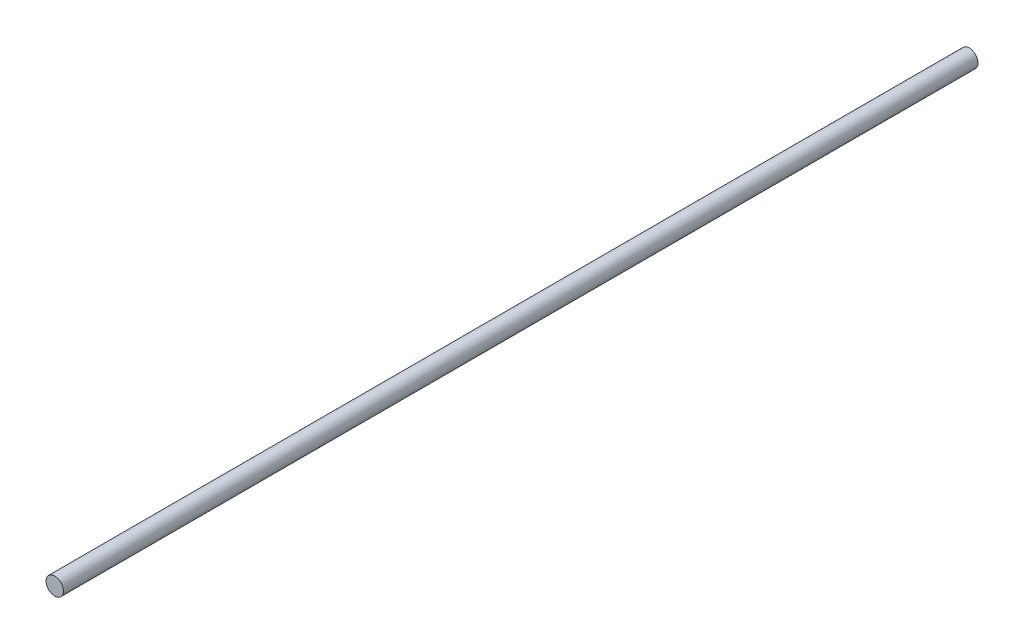
ISO-10303-21;
HEADER;
FILE_DESCRIPTION(('STEP AP214'),'2;1');
FILE_NAME('part.step','',(''),(''),'','','');
FILE_SCHEMA(('AUTOMOTIVE_DESIGN { 1 0 10303 214 1 1 1 1 }'));
ENDSEC;
DATA;
#1=APPLICATION_CONTEXT('core data for automotive mechanical design processes');
#2=APPLICATION_PROTOCOL_DEFINITION('international standard','automotive_design',2000,#1);
#3=PRODUCT_CONTEXT('',#1,'mechanical');
#4=PRODUCT('Part','Part','',(#3));
#5=PRODUCT_RELATED_PRODUCT_CATEGORY('part','',(#4));
#6=PRODUCT_DEFINITION_FORMATION('','',#4);
#7=PRODUCT_DEFINITION_CONTEXT('part definition',#1,'design');
#8=PRODUCT_DEFINITION('design','',#6,#7);
#9=PRODUCT_DEFINITION_SHAPE('','',#8);
#10=(LENGTH_UNIT() NAMED_UNIT(*) SI_UNIT(.MILLI.,.METRE.));
#11=(NAMED_UNIT(*) PLANE_ANGLE_UNIT() SI_UNIT($,.RADIAN.));
#12=(NAMED_UNIT(*) SI_UNIT($,.STERADIAN.) SOLID_ANGLE_UNIT());
#13=UNCERTAINTY_MEASURE_WITH_UNIT(LENGTH_MEASURE(1.E-05),#10,'distance_accuracy_value','');
#14=(GEOMETRIC_REPRESENTATION_CONTEXT(3) GLOBAL_UNCERTAINTY_ASSIGNED_CONTEXT((#13)) GLOBAL_UNIT_ASSIGNED_CONTEXT((#10,
#11,#12)) REPRESENTATION_CONTEXT('',''));
#15=CARTESIAN_POINT('',(0.,0.,0.));
#16=DIRECTION('',(0.,0.,1.));
#17=DIRECTION('',(1.,0.,0.));
#18=AXIS2_PLACEMENT_3D('',#15,#16,#17);
#19=CARTESIAN_POINT('',(0.,0.,831.85));
#20=DIRECTION('',(0.,0.,-1.));
#21=DIRECTION('',(-1.,0.,0.));
#22=AXIS2_PLACEMENT_3D('',#19,#20,#21);
#23=CYLINDRICAL_SURFACE('',#22,7.9375);
#24=CARTESIAN_POINT('',(0.,0.,831.85));
#25=DIRECTION('',(0.,0.,1.));
#26=DIRECTION('',(1.,0.,0.));
#27=AXIS2_PLACEMENT_3D('',#24,#25,#26);
#28=CIRCLE('',#27,7.9375);
#29=CARTESIAN_POINT('',(-7.9375,0.,831.85));
#30=VERTEX_POINT('',#29);
#31=EDGE_CURVE('E10',#30,#30,#28,.T.);
#32=CARTESIAN_POINT('',(0.,0.,0.));
#33=DIRECTION('',(0.,0.,1.));
#34=DIRECTION('',(1.,0.,0.));
#35=AXIS2_PLACEMENT_3D('',#32,#33,#34);
#36=CIRCLE('',#35,7.9375);
#37=CARTESIAN_POINT('',(-7.9375,0.,-1.11022302462516E-13));
#38=VERTEX_POINT('',#37);
#39=EDGE_CURVE('E36',#38,#38,#36,.T.);
#40=CARTESIAN_POINT('',(-7.9375,0.,831.85));
#41=CARTESIAN_POINT('',(-7.9375,0.,823.184895833333));
#42=CARTESIAN_POINT('',(-7.9375,0.,814.519791666666));
#43=CARTESIAN_POINT('',(-7.9375,0.,797.189583333333));
#44=CARTESIAN_POINT('',(-7.9375,0.,788.524479166667));
#45=CARTESIAN_POINT('',(-7.9375,0.,771.194270833333));
#46=CARTESIAN_POINT('',(-7.9375,0.,762.529166666667));
#47=CARTESIAN_POINT('',(-7.9375,0.,745.198958333333));
#48=CARTESIAN_POINT('',(-7.9375,0.,736.533854166667));
#49=CARTESIAN_POINT('',(-7.9375,0.,719.203645833333));
#50=CARTESIAN_POINT('',(-7.9375,0.,710.538541666667));
#51=CARTESIAN_POINT('',(-7.9375,0.,693.208333333333));
#52=CARTESIAN_POINT('',(-7.9375,0.,684.543229166666));
#53=CARTESIAN_POINT('',(-7.9375,0.,667.213020833333));
#54=CARTESIAN_POINT('',(-7.9375,0.,658.547916666667));
#55=CARTESIAN_POINT('',(-7.9375,0.,641.217708333333));
#56=CARTESIAN_POINT('',(-7.9375,0.,632.552604166667));
#57=CARTESIAN_POINT('',(-7.9375,0.,615.222395833333));
#58=CARTESIAN_POINT('',(-7.9375,0.,606.557291666667));
#59=CARTESIAN_POINT('',(-7.9375,0.,589.227083333333));
#60=CARTESIAN_POINT('',(-7.9375,0.,580.561979166667));
#61=CARTESIAN_POINT('',(-7.9375,0.,563.231770833333));
#62=CARTESIAN_POINT('',(-7.9375,0.,554.566666666666));
#63=CARTESIAN_POINT('',(-7.9375,0.,537.236458333333));
#64=CARTESIAN_POINT('',(-7.9375,0.,528.571354166667));
#65=CARTESIAN_POINT('',(-7.9375,0.,511.241145833333));
#66=CARTESIAN_POINT('',(-7.9375,0.,502.576041666667));
#67=CARTESIAN_POINT('',(-7.9375,0.,485.245833333333));
#68=CARTESIAN_POINT('',(-7.9375,0.,476.580729166667));
#69=CARTESIAN_POINT('',(-7.9375,0.,459.250520833333));
#70=CARTESIAN_POINT('',(-7.9375,0.,450.585416666667));
#71=CARTESIAN_POINT('',(-7.9375,0.,433.255208333333));
#72=CARTESIAN_POINT('',(-7.9375,0.,424.590104166667));
#73=CARTESIAN_POINT('',(-7.9375,0.,407.259895833333));
#74=CARTESIAN_POINT('',(-7.9375,0.,398.594791666667));
#75=CARTESIAN_POINT('',(-7.9375,0.,381.264583333333));
#76=CARTESIAN_POINT('',(-7.9375,0.,372.599479166667));
#77=CARTESIAN_POINT('',(-7.9375,0.,355.269270833333));
#78=CARTESIAN_POINT('',(-7.9375,0.,346.604166666667));
#79=CARTESIAN_POINT('',(-7.9375,0.,329.273958333333));
#80=CARTESIAN_POINT('',(-7.9375,0.,320.608854166667));
#81=CARTESIAN_POINT('',(-7.9375,0.,303.278645833333));
#82=CARTESIAN_POINT('',(-7.9375,0.,294.613541666667));
#83=CARTESIAN_POINT('',(-7.9375,0.,277.283333333333));
#84=CARTESIAN_POINT('',(-7.9375,0.,268.618229166667));
#85=CARTESIAN_POINT('',(-7.9375,0.,251.288020833333));
#86=CARTESIAN_POINT('',(-7.9375,0.,242.622916666667));
#87=CARTESIAN_POINT('',(-7.9375,0.,225.292708333333));
#88=CARTESIAN_POINT('',(-7.9375,0.,216.627604166667));
#89=CARTESIAN_POINT('',(-7.9375,0.,199.297395833333));
#90=CARTESIAN_POINT('',(-7.9375,0.,190.632291666667));
#91=CARTESIAN_POINT('',(-7.9375,0.,173.302083333333));
#92=CARTESIAN_POINT('',(-7.9375,0.,164.636979166667));
#93=CARTESIAN_POINT('',(-7.9375,0.,147.306770833333));
#94=CARTESIAN_POINT('',(-7.9375,0.,138.641666666667));
#95=CARTESIAN_POINT('',(-7.9375,0.,121.311458333333));
#96=CARTESIAN_POINT('',(-7.9375,0.,112.646354166667));
#97=CARTESIAN_POINT('',(-7.9375,0.,95.3161458333333));
#98=CARTESIAN_POINT('',(-7.9375,0.,86.6510416666666));
#99=CARTESIAN_POINT('',(-7.9375,0.,69.3208333333332));
#100=CARTESIAN_POINT('',(-7.9375,0.,60.6557291666665));
#101=CARTESIAN_POINT('',(-7.9375,0.,43.3255208333332));
#102=CARTESIAN_POINT('',(-7.9375,0.,34.6604166666665));
#103=CARTESIAN_POINT('',(-7.9375,0.,17.3302083333332));
#104=CARTESIAN_POINT('',(-7.9375,0.,8.66510416666657));
#105=CARTESIAN_POINT('',(-7.9375,0.,-1.11022302462516E-13));
#106=B_SPLINE_CURVE_WITH_KNOTS('',3,(#40,#41,#42,#43,#44,#45,#46,#47,#48,#49,#50,#51,#52,#53,
#54,#55,#56,#57,#58,#59,#60,#61,#62,#63,#64,#65,#66,#67,#68,#69,#70,#71,#72,#73,#74,#75,#76,#77,
#78,#79,#80,#81,#82,#83,#84,#85,#86,#87,#88,#89,#90,#91,#92,#93,#94,#95,#96,#97,#98,#99,#100,
#101,#102,#103,#104,#105),.UNSPECIFIED.,.F.,.F.,(4,2,2,2,2,2,2,2,2,2,2,2,2,2,2,2,2,2,2,2,2,2,2,
2,2,2,2,2,2,2,2,2,4),(0.,25.9953125,51.990625,77.9859374999999,103.98125,129.9765625,155.971875,
181.9671875,207.9625,233.9578125,259.953125,285.9484375,311.94375,337.9390625,363.934375,
389.9296875,415.925,441.9203125,467.915625,493.9109375,519.90625,545.9015625,571.896875,
597.8921875,623.8875,649.8828125,675.878125,701.8734375,727.86875,753.8640625,779.859375,
805.8546875,831.85),.UNSPECIFIED.);
#107=EDGE_CURVE('BSEAM33',#30,#38,#106,.T.);
#108=ORIENTED_EDGE('',*,*,#31,.F.);
#109=ORIENTED_EDGE('',*,*,#39,.T.);
#110=ORIENTED_EDGE('',*,*,#107,.T.);
#111=ORIENTED_EDGE('',*,*,#107,.F.);
#112=EDGE_LOOP('',(#108,#110,#109,#111));
#113=FACE_BOUND('',#112,.T.);
#114=ADVANCED_FACE('F33',(#113),#23,.T.);
#115=CARTESIAN_POINT('',(0.,0.,831.85));
#116=DIRECTION('',(0.,0.,1.));
#117=DIRECTION('',(1.,0.,0.));
#118=AXIS2_PLACEMENT_3D('',#115,#116,#117);
#119=PLANE('',#118);
#120=ORIENTED_EDGE('',*,*,#31,.T.);
#121=EDGE_LOOP('',(#120));
#122=FACE_BOUND('',#121,.T.);
#123=ADVANCED_FACE('F49',(#122),#119,.T.);
#124=CARTESIAN_POINT('',(0.,0.,0.));
#125=DIRECTION('',(0.,0.,1.));
#126=DIRECTION('',(1.,0.,0.));
#127=AXIS2_PLACEMENT_3D('',#124,#125,#126);
#128=PLANE('',#127);
#129=ORIENTED_EDGE('',*,*,#39,.F.);
#130=EDGE_LOOP('',(#129));
#131=FACE_BOUND('',#130,.T.);
#132=ADVANCED_FACE('F47',(#131),#128,.F.);
#133=CLOSED_SHELL('',(#114,#123,#132));
#134=MANIFOLD_SOLID_BREP('B2',#133);
#135=ADVANCED_BREP_SHAPE_REPRESENTATION('',(#18,#134),#14);
#136=SHAPE_DEFINITION_REPRESENTATION(#9,#135);
ENDSEC;
END-ISO-10303-21;
